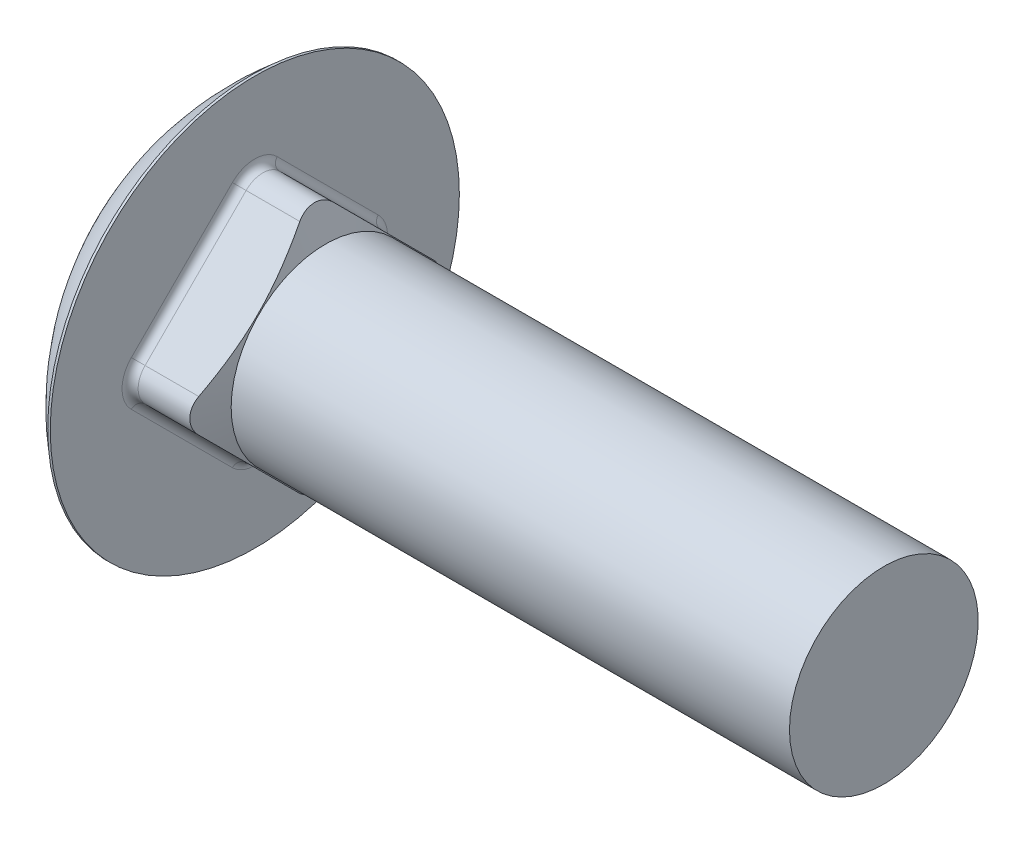
ISO-10303-21;
HEADER;
FILE_DESCRIPTION(('STEP AP214'),'2;1');
FILE_NAME('part.step','',(''),(''),'','','');
FILE_SCHEMA(('AUTOMOTIVE_DESIGN { 1 0 10303 214 1 1 1 1 }'));
ENDSEC;
DATA;
#1=APPLICATION_CONTEXT('core data for automotive mechanical design processes');
#2=APPLICATION_PROTOCOL_DEFINITION('international standard','automotive_design',2000,#1);
#3=PRODUCT_CONTEXT('',#1,'mechanical');
#4=PRODUCT('Part','Part','',(#3));
#5=PRODUCT_RELATED_PRODUCT_CATEGORY('part','',(#4));
#6=PRODUCT_DEFINITION_FORMATION('','',#4);
#7=PRODUCT_DEFINITION_CONTEXT('part definition',#1,'design');
#8=PRODUCT_DEFINITION('design','',#6,#7);
#9=PRODUCT_DEFINITION_SHAPE('','',#8);
#10=(LENGTH_UNIT() NAMED_UNIT(*) SI_UNIT(.MILLI.,.METRE.));
#11=(NAMED_UNIT(*) PLANE_ANGLE_UNIT() SI_UNIT($,.RADIAN.));
#12=(NAMED_UNIT(*) SI_UNIT($,.STERADIAN.) SOLID_ANGLE_UNIT());
#13=UNCERTAINTY_MEASURE_WITH_UNIT(LENGTH_MEASURE(1.E-05),#10,'distance_accuracy_value','');
#14=(GEOMETRIC_REPRESENTATION_CONTEXT(3) GLOBAL_UNCERTAINTY_ASSIGNED_CONTEXT((#13)) GLOBAL_UNIT_ASSIGNED_CONTEXT((#10,
#11,#12)) REPRESENTATION_CONTEXT('',''));
#15=CARTESIAN_POINT('',(0.,0.,0.));
#16=DIRECTION('',(0.,0.,1.));
#17=DIRECTION('',(1.,0.,0.));
#18=AXIS2_PLACEMENT_3D('',#15,#16,#17);
#19=CARTESIAN_POINT('',(8.5979,5.10078547676728,0.));
#20=DIRECTION('',(-1.,0.,0.));
#21=DIRECTION('',(0.,0.,1.));
#22=AXIS2_PLACEMENT_3D('',#19,#20,#21);
#23=CYLINDRICAL_SURFACE('',#22,1.1938);
#24=CARTESIAN_POINT('',(8.14588818701751,5.94472955214778,-0.844344028006459));
#25=CARTESIAN_POINT('',(8.13879361077491,5.96767504744284,-0.8214091752984));
#26=CARTESIAN_POINT('',(8.13201077283715,5.9897235056885,-0.797500213273234));
#27=CARTESIAN_POINT('',(8.11909733992044,6.03187656668557,-0.747856628020411));
#28=CARTESIAN_POINT('',(8.1129668335997,6.05198090517842,-0.722121757424227));
#29=CARTESIAN_POINT('',(8.09560693960047,6.10912030584759,-0.642404984415174));
#30=CARTESIAN_POINT('',(8.08540028124377,6.14301066504625,-0.585882086342725));
#31=CARTESIAN_POINT('',(8.06796623411413,6.20118053569369,-0.467594187156543));
#32=CARTESIAN_POINT('',(8.06074293767149,6.22544684386088,-0.405822124703871));
#33=CARTESIAN_POINT('',(8.04946273959095,6.26344447500884,-0.278867083565537));
#34=CARTESIAN_POINT('',(8.04540397069918,6.27718201049165,-0.21368614058337));
#35=CARTESIAN_POINT('',(8.04059848157516,6.29345574551803,-0.0832282337075366));
#36=CARTESIAN_POINT('',(8.0397835325602,6.29622268971675,-0.017982452590973));
#37=CARTESIAN_POINT('',(8.04129632984762,6.29109416841699,0.112058159236529));
#38=CARTESIAN_POINT('',(8.04362425164472,6.2831981075071,0.17685296456236));
#39=CARTESIAN_POINT('',(8.05132891537869,6.2571580822291,0.30347792417982));
#40=CARTESIAN_POINT('',(8.05667516522331,6.23911661699775,0.365331121736631));
#41=CARTESIAN_POINT('',(8.07027498657946,6.19347387905289,0.485072053740163));
#42=CARTESIAN_POINT('',(8.07852870079307,6.16587213710985,0.542959593380704));
#43=CARTESIAN_POINT('',(8.0960276405216,6.1077818707088,0.643310248340869));
#44=CARTESIAN_POINT('',(8.10482863690659,6.07870188159424,0.686676468293325));
#45=CARTESIAN_POINT('',(8.1241215820698,6.01540956206544,0.768976040569533));
#46=CARTESIAN_POINT('',(8.13461122961752,5.98120422061867,0.807915304282577));
#47=CARTESIAN_POINT('',(8.14588818701753,5.94472955214769,0.844344028006525));
#48=B_SPLINE_CURVE_WITH_KNOTS('',3,(#24,#25,#26,#27,#28,#29,#30,#31,#32,#33,#34,#35,#36,#37,#38,
#39,#40,#41,#42,#43,#44,#45,#46,#47),.UNSPECIFIED.,.F.,.F.,(4,2,2,2,2,2,2,2,2,2,2,4),(0.,
0.099570561647882,0.199154638664764,0.398198973686515,0.597515441743066,0.796714212387217,
0.991700275862709,1.18669722761287,1.37975863055133,1.57282951051139,1.73122873670701,
1.88941390178737),.UNSPECIFIED.);
#49=CARTESIAN_POINT('',(8.14582634869176,5.94492955214778,-0.844144075380512));
#50=VERTEX_POINT('',#49);
#51=CARTESIAN_POINT('',(8.14582634869176,5.94492955214778,0.84414407538049));
#52=VERTEX_POINT('',#51);
#53=EDGE_CURVE('E127',#50,#52,#48,.T.);
#54=ORIENTED_EDGE('',*,*,#53,.F.);
#55=DIRECTION('',(-1.,0.,0.));
#56=VECTOR('',#55,1.);
#57=CARTESIAN_POINT('',(8.5979,5.94492955214778,-0.844144075380512));
#58=LINE('',#57,#56);
#59=CARTESIAN_POINT('',(5.4356,5.94492955214778,-0.844144075380512));
#60=VERTEX_POINT('',#59);
#61=EDGE_CURVE('E134',#50,#60,#58,.T.);
#62=ORIENTED_EDGE('',*,*,#61,.T.);
#63=CARTESIAN_POINT('',(5.4356,5.10078547676728,0.));
#64=DIRECTION('',(1.,0.,0.));
#65=DIRECTION('',(0.,0.,-1.));
#66=AXIS2_PLACEMENT_3D('',#63,#64,#65);
#67=CIRCLE('',#66,1.1938);
#68=CARTESIAN_POINT('',(5.4356,5.94492955214778,0.84414407538049));
#69=VERTEX_POINT('',#68);
#70=EDGE_CURVE('E11',#60,#69,#67,.T.);
#71=ORIENTED_EDGE('',*,*,#70,.T.);
#72=DIRECTION('',(-1.,0.,0.));
#73=VECTOR('',#72,1.);
#74=CARTESIAN_POINT('',(8.5979,5.94492955214778,0.84414407538049));
#75=LINE('',#74,#73);
#76=EDGE_CURVE('E60',#52,#69,#75,.T.);
#77=ORIENTED_EDGE('',*,*,#76,.F.);
#78=EDGE_LOOP('',(#54,#62,#71,#77));
#79=FACE_BOUND('',#78,.T.);
#80=ADVANCED_FACE('F35',(#79),#23,.T.);
#81=CARTESIAN_POINT('',(8.5979,0.844144075380512,5.94492955214778));
#82=DIRECTION('',(0.,-0.707106781186549,-0.707106781186546));
#83=DIRECTION('',(0.,0.707106781186546,-0.707106781186549));
#84=AXIS2_PLACEMENT_3D('',#81,#82,#83);
#85=PLANE('',#84);
#86=CARTESIAN_POINT('',(8.14576450969113,5.94512955214778,0.843944075380489));
#87=CARTESIAN_POINT('',(8.19973991101877,5.77043557357122,1.01863805395705));
#88=CARTESIAN_POINT('',(8.25042536122229,5.59517980951485,1.19389381801342));
#89=CARTESIAN_POINT('',(8.34321511938473,5.243361910512,1.54571171701628));
#90=CARTESIAN_POINT('',(8.38531073917541,5.06679863825546,1.72227498927281));
#91=CARTESIAN_POINT('',(8.45877369371553,4.71267430658381,2.07639932094447));
#92=CARTESIAN_POINT('',(8.49014946664229,4.53511414430907,2.2539594832192));
#93=CARTESIAN_POINT('',(8.54012952986857,4.17914421016777,2.60992941736051));
#94=CARTESIAN_POINT('',(8.55873862997595,4.00073478379559,2.78833884373269));
#95=CARTESIAN_POINT('',(8.58148998159932,3.64697071353108,3.1421029139972));
#96=CARTESIAN_POINT('',(8.58591038637004,3.47162523897103,3.31744838855725));
#97=CARTESIAN_POINT('',(8.5806927024322,3.12101953161482,3.66805409591346));
#98=CARTESIAN_POINT('',(8.57105287115523,2.94575931207787,3.84331431545042));
#99=CARTESIAN_POINT('',(8.53852548007002,2.59601833278046,4.19305529474782));
#100=CARTESIAN_POINT('',(8.51564892691514,2.4215370466432,4.36753658088509));
#101=CARTESIAN_POINT('',(8.45831356066708,2.07353154453849,4.71554208298979));
#102=CARTESIAN_POINT('',(8.42385390461345,1.90000739916141,4.88906622836687));
#103=CARTESIAN_POINT('',(8.36784627677483,1.65321773845672,5.13585588907157));
#104=CARTESIAN_POINT('',(8.35021812069555,1.57949227170493,5.20958135582335));
#105=CARTESIAN_POINT('',(8.31336988454171,1.43225352993945,5.35682009758883));
#106=CARTESIAN_POINT('',(8.29415010131488,1.35874021799252,5.43033340953577));
#107=CARTESIAN_POINT('',(8.25417041326498,1.21157107541278,5.57750255211551));
#108=CARTESIAN_POINT('',(8.23340378443058,1.13791616289588,5.65115746463241));
#109=CARTESIAN_POINT('',(8.19054422596053,0.990791208321664,5.79828241920663));
#110=CARTESIAN_POINT('',(8.16845115635567,0.91732118662976,5.87175244089853));
#111=CARTESIAN_POINT('',(8.14576450969113,0.843944075380512,5.94512955214778));
#112=B_SPLINE_CURVE_WITH_KNOTS('',3,(#86,#87,#88,#89,#90,#91,#92,#93,#94,#95,#96,#97,#98,#99,
#100,#101,#102,#103,#104,#105,#106,#107,#108,#109,#110,#111),.UNSPECIFIED.,.F.,.F.,(4,2,2,2,2,2,
2,2,2,2,2,2,4),(0.,0.758735404937091,1.51823446850327,2.27713430399017,3.03574806886881,
3.77939624303526,4.52313658975951,5.26625938539667,6.00943627351757,6.32665800939076,
6.64382071423671,6.96245310742625,7.28111918276769),.UNSPECIFIED.);
#113=CARTESIAN_POINT('',(8.14582634869176,0.844144075380511,5.94492955214778));
#114=VERTEX_POINT('',#113);
#115=EDGE_CURVE('E137',#52,#114,#112,.T.);
#116=ORIENTED_EDGE('',*,*,#115,.F.);
#117=ORIENTED_EDGE('',*,*,#76,.T.);
#118=DIRECTION('',(0.,-0.707106781186546,0.707106781186549));
#119=VECTOR('',#118,1.);
#120=CARTESIAN_POINT('',(5.4356,0.844144075380512,5.94492955214778));
#121=LINE('',#120,#119);
#122=CARTESIAN_POINT('',(5.4356,0.844144075380512,5.94492955214778));
#123=VERTEX_POINT('',#122);
#124=EDGE_CURVE('E44',#69,#123,#121,.T.);
#125=ORIENTED_EDGE('',*,*,#124,.T.);
#126=DIRECTION('',(-1.,0.,0.));
#127=VECTOR('',#126,1.);
#128=CARTESIAN_POINT('',(8.5979,0.844144075380512,5.94492955214778));
#129=LINE('',#128,#127);
#130=EDGE_CURVE('E164',#114,#123,#129,.T.);
#131=ORIENTED_EDGE('',*,*,#130,.F.);
#132=EDGE_LOOP('',(#116,#117,#125,#131));
#133=FACE_BOUND('',#132,.T.);
#134=ADVANCED_FACE('F241',(#133),#85,.F.);
#135=CARTESIAN_POINT('',(8.5979,0.,5.10078547676728));
#136=DIRECTION('',(-1.,0.,0.));
#137=DIRECTION('',(0.,0.,1.));
#138=AXIS2_PLACEMENT_3D('',#135,#136,#137);
#139=CYLINDRICAL_SURFACE('',#138,1.1938);
#140=CARTESIAN_POINT('',(8.14588820167232,0.844344075380512,5.94472950475127));
#141=CARTESIAN_POINT('',(8.13879362496371,0.821409223894629,5.96767500139955));
#142=CARTESIAN_POINT('',(8.13201078655085,0.797500263034399,5.98972346104944));
#143=CARTESIAN_POINT('',(8.11909735266757,0.747856679987427,6.0318765249489));
#144=CARTESIAN_POINT('',(8.11296684585534,0.722121810432121,6.0519808649399));
#145=CARTESIAN_POINT('',(8.09560695035979,0.642405040339981,6.10912027023223));
#146=CARTESIAN_POINT('',(8.08540029097702,0.585882143943334,6.14301063268237));
#147=CARTESIAN_POINT('',(8.06796624176106,0.467594247501051,6.20118051006671));
#148=CARTESIAN_POINT('',(8.06074294425827,0.405822186115362,6.2254468217191));
#149=CARTESIAN_POINT('',(8.04946274405043,0.278867146459872,6.26344445994076));
#150=CARTESIAN_POINT('',(8.04540397409157,0.213686203893871,6.27718199901178));
#151=CARTESIAN_POINT('',(8.04059848288072,0.0832282973380148,6.29345574108852));
#152=CARTESIAN_POINT('',(8.0397835328385,0.0179825161422635,6.29622268877413));
#153=CARTESIAN_POINT('',(8.04129632809968,-0.112058096439489,6.29109417434183));
#154=CARTESIAN_POINT('',(8.04362424889708,-0.17685290244052,6.28319811681494));
#155=CARTESIAN_POINT('',(8.0513289106771,-0.303477863711587,6.25715809809842));
#156=CARTESIAN_POINT('',(8.05667515955456,-0.365331062250541,6.23911663608949));
#157=CARTESIAN_POINT('',(8.07027497902272,-0.485071996778153,6.19347390434795));
#158=CARTESIAN_POINT('',(8.07852869231765,-0.542959537957738,6.16587216537879));
#159=CARTESIAN_POINT('',(8.09602763370582,-0.643310214850087,6.10778189322536));
#160=CARTESIAN_POINT('',(8.10482863341085,-0.686676453578145,6.07870189305363));
#161=CARTESIAN_POINT('',(8.12412158662941,-0.768976059822414,6.01540954711586));
#162=CARTESIAN_POINT('',(8.13461123891321,-0.80791533872595,5.98120419031494));
#163=CARTESIAN_POINT('',(8.14588820167232,-0.84434407538049,5.94472950475127));
#164=B_SPLINE_CURVE_WITH_KNOTS('',3,(#140,#141,#142,#143,#144,#145,#146,#147,#148,#149,#150,
#151,#152,#153,#154,#155,#156,#157,#158,#159,#160,#161,#162,#163),.UNSPECIFIED.,.F.,.F.,(4,2,2,
2,2,2,2,2,2,2,2,4),(0.,0.099570562219259,0.199154639808814,0.39819897599211,0.597515445222823,
0.796714217044914,0.991700281229885,1.18669723364513,1.37975863645055,1.57282951641955,
1.73122880802611,1.88941403867777),.UNSPECIFIED.);
#165=CARTESIAN_POINT('',(8.14582634869176,-0.844144075380491,5.94492955214778));
#166=VERTEX_POINT('',#165);
#167=EDGE_CURVE('E247',#114,#166,#164,.T.);
#168=ORIENTED_EDGE('',*,*,#167,.F.);
#169=ORIENTED_EDGE('',*,*,#130,.T.);
#170=CARTESIAN_POINT('',(5.4356,0.,5.10078547676728));
#171=DIRECTION('',(1.,0.,0.));
#172=DIRECTION('',(0.,0.,-1.));
#173=AXIS2_PLACEMENT_3D('',#170,#171,#172);
#174=CIRCLE('',#173,1.1938);
#175=CARTESIAN_POINT('',(5.4356,-0.84414407538049,5.94492955214778));
#176=VERTEX_POINT('',#175);
#177=EDGE_CURVE('E205',#123,#176,#174,.T.);
#178=ORIENTED_EDGE('',*,*,#177,.T.);
#179=DIRECTION('',(-1.,0.,0.));
#180=VECTOR('',#179,1.);
#181=CARTESIAN_POINT('',(8.5979,-0.84414407538049,5.94492955214778));
#182=LINE('',#181,#180);
#183=EDGE_CURVE('E162',#166,#176,#182,.T.);
#184=ORIENTED_EDGE('',*,*,#183,.F.);
#185=EDGE_LOOP('',(#168,#169,#178,#184));
#186=FACE_BOUND('',#185,.T.);
#187=ADVANCED_FACE('F244',(#186),#139,.T.);
#188=CARTESIAN_POINT('',(8.5979,-5.94492955214778,0.844144075380511));
#189=DIRECTION('',(0.,0.707106781186546,-0.707106781186549));
#190=DIRECTION('',(0.,0.707106781186549,0.707106781186546));
#191=AXIS2_PLACEMENT_3D('',#188,#189,#190);
#192=PLANE('',#191);
#193=CARTESIAN_POINT('',(8.14576450969113,-0.84394407538049,5.94512955214778));
#194=CARTESIAN_POINT('',(8.19973991101877,-1.01863805395705,5.77043557357122));
#195=CARTESIAN_POINT('',(8.25042536122229,-1.19389381801342,5.59517980951485));
#196=CARTESIAN_POINT('',(8.34321511938474,-1.54571171701628,5.243361910512));
#197=CARTESIAN_POINT('',(8.38531073917541,-1.72227498927281,5.06679863825546));
#198=CARTESIAN_POINT('',(8.45877369371553,-2.07639932094447,4.71267430658381));
#199=CARTESIAN_POINT('',(8.49014946664229,-2.2539594832192,4.53511414430907));
#200=CARTESIAN_POINT('',(8.54012952986857,-2.60992941736051,4.17914421016777));
#201=CARTESIAN_POINT('',(8.55873862997595,-2.78833884373269,4.00073478379559));
#202=CARTESIAN_POINT('',(8.58148998159932,-3.1421029139972,3.64697071353108));
#203=CARTESIAN_POINT('',(8.58591038637005,-3.31744838855725,3.47162523897103));
#204=CARTESIAN_POINT('',(8.5806927024322,-3.66805409591346,3.12101953161482));
#205=CARTESIAN_POINT('',(8.57105287115523,-3.84331431545042,2.94575931207786));
#206=CARTESIAN_POINT('',(8.53852548007002,-4.19305529474783,2.59601833278046));
#207=CARTESIAN_POINT('',(8.51564892691514,-4.36753658088509,2.4215370466432));
#208=CARTESIAN_POINT('',(8.45831356066708,-4.71554208298979,2.07353154453849));
#209=CARTESIAN_POINT('',(8.42385390461345,-4.88906622836687,1.90000739916141));
#210=CARTESIAN_POINT('',(8.36784627677483,-5.13585588907157,1.65321773845672));
#211=CARTESIAN_POINT('',(8.35021812069555,-5.20958135582335,1.57949227170493));
#212=CARTESIAN_POINT('',(8.31336988454171,-5.35682009758883,1.43225352993945));
#213=CARTESIAN_POINT('',(8.29415010131488,-5.43033340953577,1.35874021799252));
#214=CARTESIAN_POINT('',(8.25417041326498,-5.57750255211551,1.21157107541278));
#215=CARTESIAN_POINT('',(8.23340378443058,-5.6511574646324,1.13791616289588));
#216=CARTESIAN_POINT('',(8.19054422596053,-5.79828241920662,0.990791208321663));
#217=CARTESIAN_POINT('',(8.16845115635567,-5.87175244089853,0.917321186629758));
#218=CARTESIAN_POINT('',(8.14576450969113,-5.94512955214778,0.843944075380511));
#219=B_SPLINE_CURVE_WITH_KNOTS('',3,(#193,#194,#195,#196,#197,#198,#199,#200,#201,#202,#203,
#204,#205,#206,#207,#208,#209,#210,#211,#212,#213,#214,#215,#216,#217,#218),.UNSPECIFIED.,.F.,
.F.,(4,2,2,2,2,2,2,2,2,2,2,2,4),(0.,0.758735404937091,1.51823446850327,2.27713430399017,
3.03574806886882,3.77939624303526,4.52313658975951,5.26625938539667,6.00943627351757,
6.32665800939076,6.64382071423671,6.96245310742625,7.28111918276769),.UNSPECIFIED.);
#220=CARTESIAN_POINT('',(8.14582634869176,-5.94492955214778,0.84414407538051));
#221=VERTEX_POINT('',#220);
#222=EDGE_CURVE('E249',#166,#221,#219,.T.);
#223=ORIENTED_EDGE('',*,*,#222,.F.);
#224=ORIENTED_EDGE('',*,*,#183,.T.);
#225=DIRECTION('',(0.,-0.707106781186549,-0.707106781186546));
#226=VECTOR('',#225,1.);
#227=CARTESIAN_POINT('',(5.4356,-5.94492955214778,0.844144075380511));
#228=LINE('',#227,#226);
#229=CARTESIAN_POINT('',(5.4356,-5.94492955214778,0.844144075380511));
#230=VERTEX_POINT('',#229);
#231=EDGE_CURVE('E199',#176,#230,#228,.T.);
#232=ORIENTED_EDGE('',*,*,#231,.T.);
#233=DIRECTION('',(-1.,0.,0.));
#234=VECTOR('',#233,1.);
#235=CARTESIAN_POINT('',(8.5979,-5.94492955214778,0.844144075380511));
#236=LINE('',#235,#234);
#237=EDGE_CURVE('E160',#221,#230,#236,.T.);
#238=ORIENTED_EDGE('',*,*,#237,.F.);
#239=EDGE_LOOP('',(#223,#224,#232,#238));
#240=FACE_BOUND('',#239,.T.);
#241=ADVANCED_FACE('F311',(#240),#192,.F.);
#242=CARTESIAN_POINT('',(8.5979,-5.10078547676728,0.));
#243=DIRECTION('',(-1.,0.,0.));
#244=DIRECTION('',(0.,0.,1.));
#245=AXIS2_PLACEMENT_3D('',#242,#243,#244);
#246=CYLINDRICAL_SURFACE('',#245,1.1938);
#247=CARTESIAN_POINT('',(8.14588818701753,-5.94472955214769,0.844344028006542));
#248=CARTESIAN_POINT('',(8.13879361077494,-5.96767504744276,0.821409175298486));
#249=CARTESIAN_POINT('',(8.13201077283717,-5.98972350568842,0.797500213273321));
#250=CARTESIAN_POINT('',(8.11909733992047,-6.03187656668549,0.747856628020501));
#251=CARTESIAN_POINT('',(8.11296683359973,-6.05198090517835,0.72212175742432));
#252=CARTESIAN_POINT('',(8.0956069396005,-6.10912030584753,0.642404984415271));
#253=CARTESIAN_POINT('',(8.08540028124379,-6.14301066504619,0.585882086342826));
#254=CARTESIAN_POINT('',(8.06796623411415,-6.20118053569364,0.467594187156649));
#255=CARTESIAN_POINT('',(8.0607429376715,-6.22544684386084,0.40582212470398));
#256=CARTESIAN_POINT('',(8.04946273959096,-6.26344447500881,0.278867083565648));
#257=CARTESIAN_POINT('',(8.04540397069919,-6.27718201049163,0.213686140583482));
#258=CARTESIAN_POINT('',(8.04059848157517,-6.29345574551802,0.0832282337076498));
#259=CARTESIAN_POINT('',(8.03978353256021,-6.29622268971675,0.0179824525910862));
#260=CARTESIAN_POINT('',(8.04129632984762,-6.291094168417,-0.112058159236418));
#261=CARTESIAN_POINT('',(8.04362425164472,-6.28319810750712,-0.17685296456225));
#262=CARTESIAN_POINT('',(8.05132891537868,-6.25715808222913,-0.303477924179713));
#263=CARTESIAN_POINT('',(8.0566751652233,-6.23911661699779,-0.365331121736526));
#264=CARTESIAN_POINT('',(8.07027498657945,-6.19347387905293,-0.485072053740062));
#265=CARTESIAN_POINT('',(8.07852870079306,-6.1658721371099,-0.542959593380606));
#266=CARTESIAN_POINT('',(8.09602764052158,-6.10778187070886,-0.643310248340775));
#267=CARTESIAN_POINT('',(8.10482863690657,-6.07870188159431,-0.686676468293233));
#268=CARTESIAN_POINT('',(8.12412158206978,-6.01540956206551,-0.768976040569444));
#269=CARTESIAN_POINT('',(8.1346112296175,-5.98120422061875,-0.80791530428249));
#270=CARTESIAN_POINT('',(8.14588818701751,-5.94472955214778,-0.84434402800644));
#271=B_SPLINE_CURVE_WITH_KNOTS('',3,(#247,#248,#249,#250,#251,#252,#253,#254,#255,#256,#257,
#258,#259,#260,#261,#262,#263,#264,#265,#266,#267,#268,#269,#270),.UNSPECIFIED.,.F.,.F.,(4,2,2,
2,2,2,2,2,2,2,2,4),(0.,0.0995705616478838,0.199154638664766,0.398198973686517,0.597515441743072,
0.796714212387224,0.991700275862717,1.18669722761288,1.37975863055134,1.5728295105114,
1.73122873670702,1.88941390178737),.UNSPECIFIED.);
#272=CARTESIAN_POINT('',(8.14582634869176,-5.94492955214778,-0.84414407538049));
#273=VERTEX_POINT('',#272);
#274=EDGE_CURVE('E251',#221,#273,#271,.T.);
#275=ORIENTED_EDGE('',*,*,#274,.F.);
#276=ORIENTED_EDGE('',*,*,#237,.T.);
#277=CARTESIAN_POINT('',(5.4356,-5.10078547676728,0.));
#278=DIRECTION('',(1.,0.,0.));
#279=DIRECTION('',(0.,0.,-1.));
#280=AXIS2_PLACEMENT_3D('',#277,#278,#279);
#281=CIRCLE('',#280,1.1938);
#282=CARTESIAN_POINT('',(5.4356,-5.94492955214778,-0.844144075380491));
#283=VERTEX_POINT('',#282);
#284=EDGE_CURVE('E176',#230,#283,#281,.T.);
#285=ORIENTED_EDGE('',*,*,#284,.T.);
#286=DIRECTION('',(-1.,0.,0.));
#287=VECTOR('',#286,1.);
#288=CARTESIAN_POINT('',(8.5979,-5.94492955214778,-0.844144075380491));
#289=LINE('',#288,#287);
#290=EDGE_CURVE('E158',#273,#283,#289,.T.);
#291=ORIENTED_EDGE('',*,*,#290,.F.);
#292=EDGE_LOOP('',(#275,#276,#285,#291));
#293=FACE_BOUND('',#292,.T.);
#294=ADVANCED_FACE('F307',(#293),#246,.T.);
#295=CARTESIAN_POINT('',(8.5979,-5.94492955214778,-0.844144075380491));
#296=DIRECTION('',(0.,0.707106781186549,0.707106781186546));
#297=DIRECTION('',(0.,-0.707106781186546,0.707106781186549));
#298=AXIS2_PLACEMENT_3D('',#295,#296,#297);
#299=PLANE('',#298);
#300=CARTESIAN_POINT('',(8.14576450969113,-5.94512955214778,-0.843944075380491));
#301=CARTESIAN_POINT('',(8.19973991101877,-5.77043557357122,-1.01863805395705));
#302=CARTESIAN_POINT('',(8.25042536122229,-5.59517980951485,-1.19389381801342));
#303=CARTESIAN_POINT('',(8.34321511938474,-5.243361910512,-1.54571171701628));
#304=CARTESIAN_POINT('',(8.38531073917541,-5.06679863825546,-1.72227498927282));
#305=CARTESIAN_POINT('',(8.45877369371553,-4.71267430658381,-2.07639932094447));
#306=CARTESIAN_POINT('',(8.49014946664229,-4.53511414430907,-2.2539594832192));
#307=CARTESIAN_POINT('',(8.54012952986857,-4.17914421016777,-2.60992941736051));
#308=CARTESIAN_POINT('',(8.55873862997595,-4.00073478379558,-2.78833884373269));
#309=CARTESIAN_POINT('',(8.58148998159932,-3.64697071353108,-3.1421029139972));
#310=CARTESIAN_POINT('',(8.58591038637004,-3.47162523897102,-3.31744838855725));
#311=CARTESIAN_POINT('',(8.5806927024322,-3.12101953161482,-3.66805409591346));
#312=CARTESIAN_POINT('',(8.57105287115523,-2.94575931207786,-3.84331431545042));
#313=CARTESIAN_POINT('',(8.53852548007002,-2.59601833278045,-4.19305529474783));
#314=CARTESIAN_POINT('',(8.51564892691514,-2.42153704664319,-4.36753658088509));
#315=CARTESIAN_POINT('',(8.45831356066708,-2.07353154453848,-4.7155420829898));
#316=CARTESIAN_POINT('',(8.42385390461345,-1.9000073991614,-4.88906622836688));
#317=CARTESIAN_POINT('',(8.36784627677483,-1.65321773845671,-5.13585588907157));
#318=CARTESIAN_POINT('',(8.35021812069555,-1.57949227170493,-5.20958135582336));
#319=CARTESIAN_POINT('',(8.31336988454171,-1.43225352993945,-5.35682009758884));
#320=CARTESIAN_POINT('',(8.29415010131488,-1.35874021799252,-5.43033340953577));
#321=CARTESIAN_POINT('',(8.25417041326498,-1.21157107541277,-5.57750255211551));
#322=CARTESIAN_POINT('',(8.23340378443058,-1.13791616289588,-5.65115746463241));
#323=CARTESIAN_POINT('',(8.19054422596053,-0.990791208321661,-5.79828241920663));
#324=CARTESIAN_POINT('',(8.16845115635567,-0.917321186629757,-5.87175244089853));
#325=CARTESIAN_POINT('',(8.14576450969113,-0.843944075380511,-5.94512955214778));
#326=B_SPLINE_CURVE_WITH_KNOTS('',3,(#300,#301,#302,#303,#304,#305,#306,#307,#308,#309,#310,
#311,#312,#313,#314,#315,#316,#317,#318,#319,#320,#321,#322,#323,#324,#325),.UNSPECIFIED.,.F.,
.F.,(4,2,2,2,2,2,2,2,2,2,2,2,4),(0.,0.758735404937092,1.51823446850327,2.27713430399017,
3.03574806886882,3.77939624303527,4.52313658975951,5.26625938539668,6.00943627351758,
6.32665800939076,6.64382071423671,6.96245310742625,7.28111918276769),.UNSPECIFIED.);
#327=CARTESIAN_POINT('',(8.14582634869176,-0.844144075380512,-5.94492955214778));
#328=VERTEX_POINT('',#327);
#329=EDGE_CURVE('E294',#273,#328,#326,.T.);
#330=ORIENTED_EDGE('',*,*,#329,.F.);
#331=ORIENTED_EDGE('',*,*,#290,.T.);
#332=DIRECTION('',(0.,0.707106781186546,-0.707106781186549));
#333=VECTOR('',#332,1.);
#334=CARTESIAN_POINT('',(5.4356,-5.94492955214778,-0.844144075380491));
#335=LINE('',#334,#333);
#336=CARTESIAN_POINT('',(5.4356,-0.844144075380511,-5.94492955214778));
#337=VERTEX_POINT('',#336);
#338=EDGE_CURVE('E196',#283,#337,#335,.T.);
#339=ORIENTED_EDGE('',*,*,#338,.T.);
#340=DIRECTION('',(-1.,0.,0.));
#341=VECTOR('',#340,1.);
#342=CARTESIAN_POINT('',(8.5979,-0.844144075380511,-5.94492955214778));
#343=LINE('',#342,#341);
#344=EDGE_CURVE('E145',#328,#337,#343,.T.);
#345=ORIENTED_EDGE('',*,*,#344,.F.);
#346=EDGE_LOOP('',(#330,#331,#339,#345));
#347=FACE_BOUND('',#346,.T.);
#348=ADVANCED_FACE('F310',(#347),#299,.F.);
#349=CARTESIAN_POINT('',(8.5979,0.,-5.10078547676728));
#350=DIRECTION('',(-1.,0.,0.));
#351=DIRECTION('',(0.,0.,1.));
#352=AXIS2_PLACEMENT_3D('',#349,#350,#351);
#353=CYLINDRICAL_SURFACE('',#352,1.1938);
#354=CARTESIAN_POINT('',(8.14588820167232,-0.844344075380511,-5.94472950475127));
#355=CARTESIAN_POINT('',(8.13879362496371,-0.821409223894628,-5.96767500139955));
#356=CARTESIAN_POINT('',(8.13201078655085,-0.797500263034398,-5.98972346104944));
#357=CARTESIAN_POINT('',(8.11909735266757,-0.747856679987426,-6.0318765249489));
#358=CARTESIAN_POINT('',(8.11296684585534,-0.72212181043212,-6.0519808649399));
#359=CARTESIAN_POINT('',(8.09560695035979,-0.642405040339981,-6.10912027023223));
#360=CARTESIAN_POINT('',(8.08540029097702,-0.585882143943333,-6.14301063268237));
#361=CARTESIAN_POINT('',(8.06796624176106,-0.467594247501051,-6.20118051006671));
#362=CARTESIAN_POINT('',(8.06074294425827,-0.405822186115363,-6.2254468217191));
#363=CARTESIAN_POINT('',(8.04946274405043,-0.278867146459872,-6.26344445994076));
#364=CARTESIAN_POINT('',(8.04540397409157,-0.213686203893871,-6.27718199901178));
#365=CARTESIAN_POINT('',(8.04059848288072,-0.0832282973380148,-6.29345574108852));
#366=CARTESIAN_POINT('',(8.03978353283851,-0.0179825161422636,-6.29622268877413));
#367=CARTESIAN_POINT('',(8.04129632809968,0.112058096439489,-6.29109417434183));
#368=CARTESIAN_POINT('',(8.04362424889708,0.17685290244052,-6.28319811681494));
#369=CARTESIAN_POINT('',(8.0513289106771,0.303477863711586,-6.25715809809842));
#370=CARTESIAN_POINT('',(8.05667515955456,0.365331062250541,-6.23911663608949));
#371=CARTESIAN_POINT('',(8.07027497902272,0.485071996778152,-6.19347390434795));
#372=CARTESIAN_POINT('',(8.07852869231765,0.542959537957738,-6.16587216537879));
#373=CARTESIAN_POINT('',(8.09602763370582,0.643310214850087,-6.10778189322536));
#374=CARTESIAN_POINT('',(8.10482863341085,0.686676453578144,-6.07870189305363));
#375=CARTESIAN_POINT('',(8.12412158662941,0.768976059822414,-6.01540954711586));
#376=CARTESIAN_POINT('',(8.13461123891321,0.80791533872595,-5.98120419031494));
#377=CARTESIAN_POINT('',(8.14588820167232,0.84434407538049,-5.94472950475127));
#378=B_SPLINE_CURVE_WITH_KNOTS('',3,(#354,#355,#356,#357,#358,#359,#360,#361,#362,#363,#364,
#365,#366,#367,#368,#369,#370,#371,#372,#373,#374,#375,#376,#377),.UNSPECIFIED.,.F.,.F.,(4,2,2,
2,2,2,2,2,2,2,2,4),(0.,0.0995705622192588,0.199154639808814,0.398198975992109,0.597515445222821,
0.796714217044913,0.991700281229884,1.18669723364513,1.37975863645055,1.57282951641955,
1.73122880802611,1.88941403867776),.UNSPECIFIED.);
#379=CARTESIAN_POINT('',(8.14582634869176,0.84414407538049,-5.94492955214778));
#380=VERTEX_POINT('',#379);
#381=EDGE_CURVE('E52',#328,#380,#378,.T.);
#382=ORIENTED_EDGE('',*,*,#381,.F.);
#383=ORIENTED_EDGE('',*,*,#344,.T.);
#384=CARTESIAN_POINT('',(5.4356,0.,-5.10078547676728));
#385=DIRECTION('',(1.,0.,0.));
#386=DIRECTION('',(0.,0.,-1.));
#387=AXIS2_PLACEMENT_3D('',#384,#385,#386);
#388=CIRCLE('',#387,1.1938);
#389=CARTESIAN_POINT('',(5.4356,0.84414407538049,-5.94492955214778));
#390=VERTEX_POINT('',#389);
#391=EDGE_CURVE('E202',#337,#390,#388,.T.);
#392=ORIENTED_EDGE('',*,*,#391,.T.);
#393=DIRECTION('',(-1.,0.,0.));
#394=VECTOR('',#393,1.);
#395=CARTESIAN_POINT('',(8.5979,0.84414407538049,-5.94492955214778));
#396=LINE('',#395,#394);
#397=EDGE_CURVE('E143',#380,#390,#396,.T.);
#398=ORIENTED_EDGE('',*,*,#397,.F.);
#399=EDGE_LOOP('',(#382,#383,#392,#398));
#400=FACE_BOUND('',#399,.T.);
#401=ADVANCED_FACE('F391',(#400),#353,.T.);
#402=CARTESIAN_POINT('',(8.5979,0.844144075380491,-5.94492955214778));
#403=DIRECTION('',(0.,-0.707106781186546,0.707106781186549));
#404=DIRECTION('',(0.,-0.707106781186549,-0.707106781186546));
#405=AXIS2_PLACEMENT_3D('',#402,#403,#404);
#406=PLANE('',#405);
#407=CARTESIAN_POINT('',(8.14576450969113,0.84394407538049,-5.94512955214778));
#408=CARTESIAN_POINT('',(8.19973991101877,1.01863805395705,-5.77043557357122));
#409=CARTESIAN_POINT('',(8.25042536122229,1.19389381801342,-5.59517980951485));
#410=CARTESIAN_POINT('',(8.34321511938473,1.54571171701628,-5.243361910512));
#411=CARTESIAN_POINT('',(8.38531073917541,1.72227498927281,-5.06679863825546));
#412=CARTESIAN_POINT('',(8.45877369371553,2.07639932094447,-4.71267430658381));
#413=CARTESIAN_POINT('',(8.49014946664229,2.2539594832192,-4.53511414430907));
#414=CARTESIAN_POINT('',(8.54012952986857,2.60992941736051,-4.17914421016777));
#415=CARTESIAN_POINT('',(8.55873862997595,2.78833884373269,-4.00073478379558));
#416=CARTESIAN_POINT('',(8.58148998159932,3.1421029139972,-3.64697071353108));
#417=CARTESIAN_POINT('',(8.58591038637004,3.31744838855725,-3.47162523897103));
#418=CARTESIAN_POINT('',(8.5806927024322,3.66805409591346,-3.12101953161482));
#419=CARTESIAN_POINT('',(8.57105287115523,3.84331431545042,-2.94575931207786));
#420=CARTESIAN_POINT('',(8.53852548007002,4.19305529474783,-2.59601833278045));
#421=CARTESIAN_POINT('',(8.51564892691514,4.36753658088509,-2.42153704664319));
#422=CARTESIAN_POINT('',(8.45831356066708,4.7155420829898,-2.07353154453849));
#423=CARTESIAN_POINT('',(8.42385390461345,4.88906622836688,-1.90000739916141));
#424=CARTESIAN_POINT('',(8.36784627677483,5.13585588907157,-1.65321773845672));
#425=CARTESIAN_POINT('',(8.35021812069555,5.20958135582336,-1.57949227170493));
#426=CARTESIAN_POINT('',(8.31336988454171,5.35682009758884,-1.43225352993945));
#427=CARTESIAN_POINT('',(8.29415010131487,5.43033340953577,-1.35874021799252));
#428=CARTESIAN_POINT('',(8.25417041326498,5.57750255211551,-1.21157107541278));
#429=CARTESIAN_POINT('',(8.23340378443058,5.65115746463241,-1.13791616289588));
#430=CARTESIAN_POINT('',(8.19054422596053,5.79828241920663,-0.990791208321663));
#431=CARTESIAN_POINT('',(8.16845115635567,5.87175244089853,-0.917321186629759));
#432=CARTESIAN_POINT('',(8.14576450969113,5.94512955214778,-0.843944075380512));
#433=B_SPLINE_CURVE_WITH_KNOTS('',3,(#407,#408,#409,#410,#411,#412,#413,#414,#415,#416,#417,
#418,#419,#420,#421,#422,#423,#424,#425,#426,#427,#428,#429,#430,#431,#432),.UNSPECIFIED.,.F.,
.F.,(4,2,2,2,2,2,2,2,2,2,2,2,4),(0.,0.75873540493709,1.51823446850327,2.27713430399017,
3.03574806886882,3.77939624303527,4.52313658975951,5.26625938539668,6.00943627351758,
6.32665800939076,6.64382071423671,6.96245310742625,7.28111918276769),.UNSPECIFIED.);
#434=EDGE_CURVE('E124',#380,#50,#433,.T.);
#435=ORIENTED_EDGE('',*,*,#434,.F.);
#436=ORIENTED_EDGE('',*,*,#397,.T.);
#437=DIRECTION('',(0.,0.707106781186549,0.707106781186546));
#438=VECTOR('',#437,1.);
#439=CARTESIAN_POINT('',(5.4356,0.844144075380491,-5.94492955214778));
#440=LINE('',#439,#438);
#441=EDGE_CURVE('E141',#390,#60,#440,.T.);
#442=ORIENTED_EDGE('',*,*,#441,.T.);
#443=ORIENTED_EDGE('',*,*,#61,.F.);
#444=EDGE_LOOP('',(#435,#436,#442,#443));
#445=FACE_BOUND('',#444,.T.);
#446=ADVANCED_FACE('F139',(#445),#406,.F.);
#447=CARTESIAN_POINT('',(5.0292,10.3251,0.));
#448=DIRECTION('',(1.,0.,0.));
#449=DIRECTION('',(0.,0.,-1.));
#450=AXIS2_PLACEMENT_3D('',#447,#448,#449);
#451=PLANE('',#450);
#452=DIRECTION('',(0.,0.707106781186546,-0.707106781186549));
#453=VECTOR('',#452,1.);
#454=CARTESIAN_POINT('',(5.0292,1.48064499036163,-8.84445500963835));
#455=LINE('',#454,#453);
#456=CARTESIAN_POINT('',(5.0292,-1.13151227125472,-6.23229774802199));
#457=VERTEX_POINT('',#456);
#458=CARTESIAN_POINT('',(5.0292,-6.23229774802199,-1.1315122712547));
#459=VERTEX_POINT('',#458);
#460=EDGE_CURVE('E191',#457,#459,#455,.F.);
#461=ORIENTED_EDGE('',*,*,#460,.T.);
#462=CARTESIAN_POINT('',(5.0292,-5.10078547676728,0.));
#463=DIRECTION('',(1.,0.,0.));
#464=DIRECTION('',(0.,0.,-1.));
#465=AXIS2_PLACEMENT_3D('',#462,#463,#464);
#466=CIRCLE('',#465,1.6002);
#467=CARTESIAN_POINT('',(5.0292,-6.23229774802199,1.13151227125472));
#468=VERTEX_POINT('',#467);
#469=EDGE_CURVE('E193',#459,#468,#466,.F.);
#470=ORIENTED_EDGE('',*,*,#469,.T.);
#471=DIRECTION('',(0.,-0.707106781186549,-0.707106781186546));
#472=VECTOR('',#471,1.);
#473=CARTESIAN_POINT('',(5.0292,1.48064499036167,8.84445500963836));
#474=LINE('',#473,#472);
#475=CARTESIAN_POINT('',(5.0292,-1.1315122712547,6.23229774802199));
#476=VERTEX_POINT('',#475);
#477=EDGE_CURVE('E189',#468,#476,#474,.F.);
#478=ORIENTED_EDGE('',*,*,#477,.T.);
#479=CARTESIAN_POINT('',(5.0292,0.,5.10078547676728));
#480=DIRECTION('',(1.,0.,0.));
#481=DIRECTION('',(0.,0.,-1.));
#482=AXIS2_PLACEMENT_3D('',#479,#480,#481);
#483=CIRCLE('',#482,1.6002);
#484=CARTESIAN_POINT('',(5.0292,1.13151227125472,6.23229774802199));
#485=VERTEX_POINT('',#484);
#486=EDGE_CURVE('E185',#476,#485,#483,.F.);
#487=ORIENTED_EDGE('',*,*,#486,.T.);
#488=DIRECTION('',(0.,-0.707106781186546,0.707106781186549));
#489=VECTOR('',#488,1.);
#490=CARTESIAN_POINT('',(5.0292,8.84445500963834,-1.48064499036165));
#491=LINE('',#490,#489);
#492=CARTESIAN_POINT('',(5.0292,6.23229774802199,1.1315122712547));
#493=VERTEX_POINT('',#492);
#494=EDGE_CURVE('E181',#485,#493,#491,.F.);
#495=ORIENTED_EDGE('',*,*,#494,.T.);
#496=CARTESIAN_POINT('',(5.0292,5.10078547676728,0.));
#497=DIRECTION('',(1.,0.,0.));
#498=DIRECTION('',(0.,0.,-1.));
#499=AXIS2_PLACEMENT_3D('',#496,#497,#498);
#500=CIRCLE('',#499,1.6002);
#501=CARTESIAN_POINT('',(5.0292,6.23229774802199,-1.13151227125472));
#502=VERTEX_POINT('',#501);
#503=EDGE_CURVE('E179',#493,#502,#500,.F.);
#504=ORIENTED_EDGE('',*,*,#503,.T.);
#505=DIRECTION('',(0.,0.707106781186549,0.707106781186546));
#506=VECTOR('',#505,1.);
#507=CARTESIAN_POINT('',(5.0292,8.84445500963836,1.48064499036164));
#508=LINE('',#507,#506);
#509=CARTESIAN_POINT('',(5.0292,1.1315122712547,-6.23229774802199));
#510=VERTEX_POINT('',#509);
#511=EDGE_CURVE('E183',#502,#510,#508,.F.);
#512=ORIENTED_EDGE('',*,*,#511,.T.);
#513=CARTESIAN_POINT('',(5.0292,0.,-5.10078547676728));
#514=DIRECTION('',(1.,0.,0.));
#515=DIRECTION('',(0.,0.,-1.));
#516=AXIS2_PLACEMENT_3D('',#513,#514,#515);
#517=CIRCLE('',#516,1.6002);
#518=EDGE_CURVE('E187',#510,#457,#517,.F.);
#519=ORIENTED_EDGE('',*,*,#518,.T.);
#520=EDGE_LOOP('',(#461,#470,#478,#487,#495,#504,#512,#519));
#521=FACE_BOUND('',#520,.T.);
#522=CARTESIAN_POINT('',(5.0292,0.,0.));
#523=DIRECTION('',(-1.,0.,0.));
#524=DIRECTION('',(0.,0.,1.));
#525=AXIS2_PLACEMENT_3D('',#522,#523,#524);
#526=CIRCLE('',#525,10.3251);
#527=CARTESIAN_POINT('',(5.0292,0.,10.3251));
#528=VERTEX_POINT('',#527);
#529=EDGE_CURVE('E170',#528,#528,#526,.T.);
#530=ORIENTED_EDGE('',*,*,#529,.F.);
#531=EDGE_LOOP('',(#530));
#532=FACE_BOUND('',#531,.T.);
#533=ADVANCED_FACE('F332',(#521,#532),#451,.T.);
#534=CARTESIAN_POINT('',(13.3245537564767,0.,0.));
#535=DIRECTION('',(-1.,0.,0.));
#536=DIRECTION('',(0.,1.,0.));
#537=AXIS2_PLACEMENT_3D('',#534,#535,#536);
#538=SPHERICAL_SURFACE('',#537,13.3245537564767);
#539=CARTESIAN_POINT('',(4.9022,0.,0.));
#540=DIRECTION('',(-1.,0.,0.));
#541=DIRECTION('',(0.,0.,1.));
#542=AXIS2_PLACEMENT_3D('',#539,#540,#541);
#543=CIRCLE('',#542,10.3251);
#544=CARTESIAN_POINT('',(4.9022,0.,10.3251));
#545=VERTEX_POINT('',#544);
#546=EDGE_CURVE('E167',#545,#545,#543,.T.);
#547=ORIENTED_EDGE('',*,*,#546,.T.);
#548=EDGE_LOOP('',(#547));
#549=FACE_BOUND('',#548,.T.);
#550=ADVANCED_FACE('F330',(#549),#538,.T.);
#551=CARTESIAN_POINT('',(0.,0.,0.));
#552=DIRECTION('',(-1.,0.,0.));
#553=DIRECTION('',(0.,0.,1.));
#554=AXIS2_PLACEMENT_3D('',#551,#552,#553);
#555=CYLINDRICAL_SURFACE('',#554,10.3251);
#556=ORIENTED_EDGE('',*,*,#546,.F.);
#557=EDGE_LOOP('',(#556));
#558=FACE_BOUND('',#557,.T.);
#559=ORIENTED_EDGE('',*,*,#529,.T.);
#560=EDGE_LOOP('',(#559));
#561=FACE_BOUND('',#560,.T.);
#562=ADVANCED_FACE('F327',(#558,#561),#555,.T.);
#563=CARTESIAN_POINT('',(5.4356,5.10078547676728,0.));
#564=DIRECTION('',(1.,0.,0.));
#565=DIRECTION('',(0.,0.,-1.));
#566=AXIS2_PLACEMENT_3D('',#563,#564,#565);
#567=TOROIDAL_SURFACE('',#566,1.6002,0.4064);
#568=CARTESIAN_POINT('',(5.4356,6.23229774802199,-1.13151227125472));
#569=DIRECTION('',(0.,0.707106781186549,0.707106781186546));
#570=DIRECTION('',(0.,-0.707106781186546,0.707106781186549));
#571=AXIS2_PLACEMENT_3D('',#568,#569,#570);
#572=CIRCLE('',#571,0.4064);
#573=EDGE_CURVE('E148',#502,#60,#572,.T.);
#574=ORIENTED_EDGE('',*,*,#573,.F.);
#575=ORIENTED_EDGE('',*,*,#503,.F.);
#576=CARTESIAN_POINT('',(5.4356,6.23229774802199,1.1315122712547));
#577=DIRECTION('',(0.,0.707106781186546,-0.707106781186549));
#578=DIRECTION('',(0.,0.707106781186549,0.707106781186546));
#579=AXIS2_PLACEMENT_3D('',#576,#577,#578);
#580=CIRCLE('',#579,0.4064);
#581=EDGE_CURVE('E39',#69,#493,#580,.T.);
#582=ORIENTED_EDGE('',*,*,#581,.F.);
#583=ORIENTED_EDGE('',*,*,#70,.F.);
#584=EDGE_LOOP('',(#574,#575,#582,#583));
#585=FACE_BOUND('',#584,.T.);
#586=ADVANCED_FACE('F37',(#585),#567,.F.);
#587=CARTESIAN_POINT('',(5.4356,1.13151227125473,6.23229774802199));
#588=DIRECTION('',(0.,-0.707106781186546,0.707106781186549));
#589=DIRECTION('',(0.,-0.707106781186549,-0.707106781186546));
#590=AXIS2_PLACEMENT_3D('',#587,#588,#589);
#591=CYLINDRICAL_SURFACE('',#590,0.4064);
#592=ORIENTED_EDGE('',*,*,#581,.T.);
#593=ORIENTED_EDGE('',*,*,#494,.F.);
#594=CARTESIAN_POINT('',(5.4356,1.13151227125473,6.23229774802199));
#595=DIRECTION('',(0.,0.707106781186546,-0.707106781186549));
#596=DIRECTION('',(0.,0.707106781186549,0.707106781186546));
#597=AXIS2_PLACEMENT_3D('',#594,#595,#596);
#598=CIRCLE('',#597,0.4064);
#599=EDGE_CURVE('E223',#123,#485,#598,.T.);
#600=ORIENTED_EDGE('',*,*,#599,.F.);
#601=ORIENTED_EDGE('',*,*,#124,.F.);
#602=EDGE_LOOP('',(#592,#593,#600,#601));
#603=FACE_BOUND('',#602,.T.);
#604=ADVANCED_FACE('F238',(#603),#591,.F.);
#605=CARTESIAN_POINT('',(5.4356,1.1315122712547,-6.23229774802199));
#606=DIRECTION('',(0.,0.707106781186549,0.707106781186546));
#607=DIRECTION('',(0.,-0.707106781186546,0.707106781186549));
#608=AXIS2_PLACEMENT_3D('',#605,#606,#607);
#609=CYLINDRICAL_SURFACE('',#608,0.4064);
#610=ORIENTED_EDGE('',*,*,#573,.T.);
#611=ORIENTED_EDGE('',*,*,#441,.F.);
#612=CARTESIAN_POINT('',(5.4356,1.1315122712547,-6.23229774802199));
#613=DIRECTION('',(0.,0.707106781186548,0.707106781186547));
#614=DIRECTION('',(0.,-0.707106781186547,0.707106781186548));
#615=AXIS2_PLACEMENT_3D('',#612,#613,#614);
#616=CIRCLE('',#615,0.4064);
#617=EDGE_CURVE('E220',#510,#390,#616,.T.);
#618=ORIENTED_EDGE('',*,*,#617,.F.);
#619=ORIENTED_EDGE('',*,*,#511,.F.);
#620=EDGE_LOOP('',(#610,#611,#618,#619));
#621=FACE_BOUND('',#620,.T.);
#622=ADVANCED_FACE('F229',(#621),#609,.F.);
#623=CARTESIAN_POINT('',(5.4356,0.,5.10078547676728));
#624=DIRECTION('',(1.,0.,0.));
#625=DIRECTION('',(0.,0.,-1.));
#626=AXIS2_PLACEMENT_3D('',#623,#624,#625);
#627=TOROIDAL_SURFACE('',#626,1.6002,0.4064);
#628=ORIENTED_EDGE('',*,*,#599,.T.);
#629=ORIENTED_EDGE('',*,*,#486,.F.);
#630=CARTESIAN_POINT('',(5.4356,-1.1315122712547,6.23229774802199));
#631=DIRECTION('',(0.,0.707106781186549,0.707106781186547));
#632=DIRECTION('',(0.,-0.707106781186547,0.707106781186549));
#633=AXIS2_PLACEMENT_3D('',#630,#631,#632);
#634=CIRCLE('',#633,0.4064);
#635=EDGE_CURVE('E217',#176,#476,#634,.T.);
#636=ORIENTED_EDGE('',*,*,#635,.F.);
#637=ORIENTED_EDGE('',*,*,#177,.F.);
#638=EDGE_LOOP('',(#628,#629,#636,#637));
#639=FACE_BOUND('',#638,.T.);
#640=ADVANCED_FACE('F360',(#639),#627,.F.);
#641=CARTESIAN_POINT('',(5.4356,0.,-5.10078547676728));
#642=DIRECTION('',(1.,0.,0.));
#643=DIRECTION('',(0.,0.,-1.));
#644=AXIS2_PLACEMENT_3D('',#641,#642,#643);
#645=TOROIDAL_SURFACE('',#644,1.6002,0.4064);
#646=ORIENTED_EDGE('',*,*,#617,.T.);
#647=ORIENTED_EDGE('',*,*,#391,.F.);
#648=CARTESIAN_POINT('',(5.4356,-1.13151227125472,-6.23229774802199));
#649=DIRECTION('',(0.,0.707106781186546,-0.707106781186549));
#650=DIRECTION('',(0.,0.707106781186549,0.707106781186546));
#651=AXIS2_PLACEMENT_3D('',#648,#649,#650);
#652=CIRCLE('',#651,0.4064);
#653=EDGE_CURVE('E214',#457,#337,#652,.T.);
#654=ORIENTED_EDGE('',*,*,#653,.F.);
#655=ORIENTED_EDGE('',*,*,#518,.F.);
#656=EDGE_LOOP('',(#646,#647,#654,#655));
#657=FACE_BOUND('',#656,.T.);
#658=ADVANCED_FACE('F356',(#657),#645,.F.);
#659=CARTESIAN_POINT('',(5.4356,-6.23229774802199,1.13151227125472));
#660=DIRECTION('',(0.,-0.707106781186549,-0.707106781186546));
#661=DIRECTION('',(0.,0.707106781186546,-0.707106781186549));
#662=AXIS2_PLACEMENT_3D('',#659,#660,#661);
#663=CYLINDRICAL_SURFACE('',#662,0.4064);
#664=ORIENTED_EDGE('',*,*,#635,.T.);
#665=ORIENTED_EDGE('',*,*,#477,.F.);
#666=CARTESIAN_POINT('',(5.4356,-6.23229774802199,1.13151227125472));
#667=DIRECTION('',(0.,0.707106781186549,0.707106781186546));
#668=DIRECTION('',(0.,-0.707106781186546,0.707106781186549));
#669=AXIS2_PLACEMENT_3D('',#666,#667,#668);
#670=CIRCLE('',#669,0.4064);
#671=EDGE_CURVE('E212',#230,#468,#670,.T.);
#672=ORIENTED_EDGE('',*,*,#671,.F.);
#673=ORIENTED_EDGE('',*,*,#231,.F.);
#674=EDGE_LOOP('',(#664,#665,#672,#673));
#675=FACE_BOUND('',#674,.T.);
#676=ADVANCED_FACE('F352',(#675),#663,.F.);
#677=CARTESIAN_POINT('',(5.4356,-6.23229774802199,-1.1315122712547));
#678=DIRECTION('',(0.,0.707106781186546,-0.707106781186549));
#679=DIRECTION('',(0.,0.707106781186549,0.707106781186546));
#680=AXIS2_PLACEMENT_3D('',#677,#678,#679);
#681=CYLINDRICAL_SURFACE('',#680,0.4064);
#682=ORIENTED_EDGE('',*,*,#653,.T.);
#683=ORIENTED_EDGE('',*,*,#338,.F.);
#684=CARTESIAN_POINT('',(5.4356,-6.23229774802199,-1.1315122712547));
#685=DIRECTION('',(0.,0.707106781186546,-0.707106781186549));
#686=DIRECTION('',(0.,0.707106781186549,0.707106781186546));
#687=AXIS2_PLACEMENT_3D('',#684,#685,#686);
#688=CIRCLE('',#687,0.4064);
#689=EDGE_CURVE('E136',#459,#283,#688,.T.);
#690=ORIENTED_EDGE('',*,*,#689,.F.);
#691=ORIENTED_EDGE('',*,*,#460,.F.);
#692=EDGE_LOOP('',(#682,#683,#690,#691));
#693=FACE_BOUND('',#692,.T.);
#694=ADVANCED_FACE('F348',(#693),#681,.F.);
#695=CARTESIAN_POINT('',(5.4356,-5.10078547676728,0.));
#696=DIRECTION('',(1.,0.,0.));
#697=DIRECTION('',(0.,0.,-1.));
#698=AXIS2_PLACEMENT_3D('',#695,#696,#697);
#699=TOROIDAL_SURFACE('',#698,1.6002,0.4064);
#700=ORIENTED_EDGE('',*,*,#671,.T.);
#701=ORIENTED_EDGE('',*,*,#469,.F.);
#702=ORIENTED_EDGE('',*,*,#689,.T.);
#703=ORIENTED_EDGE('',*,*,#284,.F.);
#704=EDGE_LOOP('',(#700,#701,#702,#703));
#705=FACE_BOUND('',#704,.T.);
#706=ADVANCED_FACE('F274',(#705),#699,.F.);
#707=CARTESIAN_POINT('',(1.95085719968997,0.,0.));
#708=DIRECTION('',(-1.,0.,0.));
#709=DIRECTION('',(0.,-1.,0.));
#710=AXIS2_PLACEMENT_3D('',#707,#708,#709);
#711=CONICAL_SURFACE('',#710,23.0251,1.22173047639603);
#712=CARTESIAN_POINT('',(8.5979,0.,0.));
#713=DIRECTION('',(-1.,0.,0.));
#714=DIRECTION('',(0.,-1.,0.));
#715=AXIS2_PLACEMENT_3D('',#712,#713,#714);
#716=CIRCLE('',#715,4.7625);
#717=CARTESIAN_POINT('',(8.5979,-4.76249999999999,0.));
#718=VERTEX_POINT('',#717);
#719=EDGE_CURVE('E131',#718,#718,#716,.T.);
#720=ORIENTED_EDGE('',*,*,#719,.T.);
#721=EDGE_LOOP('',(#720));
#722=FACE_BOUND('',#721,.T.);
#723=ORIENTED_EDGE('',*,*,#53,.T.);
#724=ORIENTED_EDGE('',*,*,#115,.T.);
#725=ORIENTED_EDGE('',*,*,#167,.T.);
#726=ORIENTED_EDGE('',*,*,#222,.T.);
#727=ORIENTED_EDGE('',*,*,#274,.T.);
#728=ORIENTED_EDGE('',*,*,#329,.T.);
#729=ORIENTED_EDGE('',*,*,#381,.T.);
#730=ORIENTED_EDGE('',*,*,#434,.T.);
#731=EDGE_LOOP('',(#723,#724,#725,#726,#727,#728,#729,#730));
#732=FACE_BOUND('',#731,.T.);
#733=ADVANCED_FACE('F126',(#722,#732),#711,.T.);
#734=CARTESIAN_POINT('',(36.7792,4.7625,0.));
#735=DIRECTION('',(1.,0.,0.));
#736=DIRECTION('',(0.,0.,-1.));
#737=AXIS2_PLACEMENT_3D('',#734,#735,#736);
#738=PLANE('',#737);
#739=CARTESIAN_POINT('',(36.7792,0.,0.));
#740=DIRECTION('',(-1.,0.,0.));
#741=DIRECTION('',(0.,0.,1.));
#742=AXIS2_PLACEMENT_3D('',#739,#740,#741);
#743=CIRCLE('',#742,4.7625);
#744=CARTESIAN_POINT('',(36.7792,0.,4.7625));
#745=VERTEX_POINT('',#744);
#746=EDGE_CURVE('E173',#745,#745,#743,.T.);
#747=ORIENTED_EDGE('',*,*,#746,.F.);
#748=EDGE_LOOP('',(#747));
#749=FACE_BOUND('',#748,.T.);
#750=ADVANCED_FACE('F273',(#749),#738,.T.);
#751=CARTESIAN_POINT('',(0.,0.,0.));
#752=DIRECTION('',(-1.,0.,0.));
#753=DIRECTION('',(0.,0.,1.));
#754=AXIS2_PLACEMENT_3D('',#751,#752,#753);
#755=CYLINDRICAL_SURFACE('',#754,4.7625);
#756=ORIENTED_EDGE('',*,*,#719,.F.);
#757=EDGE_LOOP('',(#756));
#758=FACE_BOUND('',#757,.T.);
#759=ORIENTED_EDGE('',*,*,#746,.T.);
#760=EDGE_LOOP('',(#759));
#761=FACE_BOUND('',#760,.T.);
#762=ADVANCED_FACE('F336',(#758,#761),#755,.T.);
#763=CLOSED_SHELL('',(#80,#134,#187,#241,#294,#348,#401,#446,#533,#550,#562,#586,#604,#622,#640,
#658,#676,#694,#706,#733,#750,#762));
#764=MANIFOLD_SOLID_BREP('B2',#763);
#765=ADVANCED_BREP_SHAPE_REPRESENTATION('',(#18,#764),#14);
#766=SHAPE_DEFINITION_REPRESENTATION(#9,#765);
ENDSEC;
END-ISO-10303-21;
